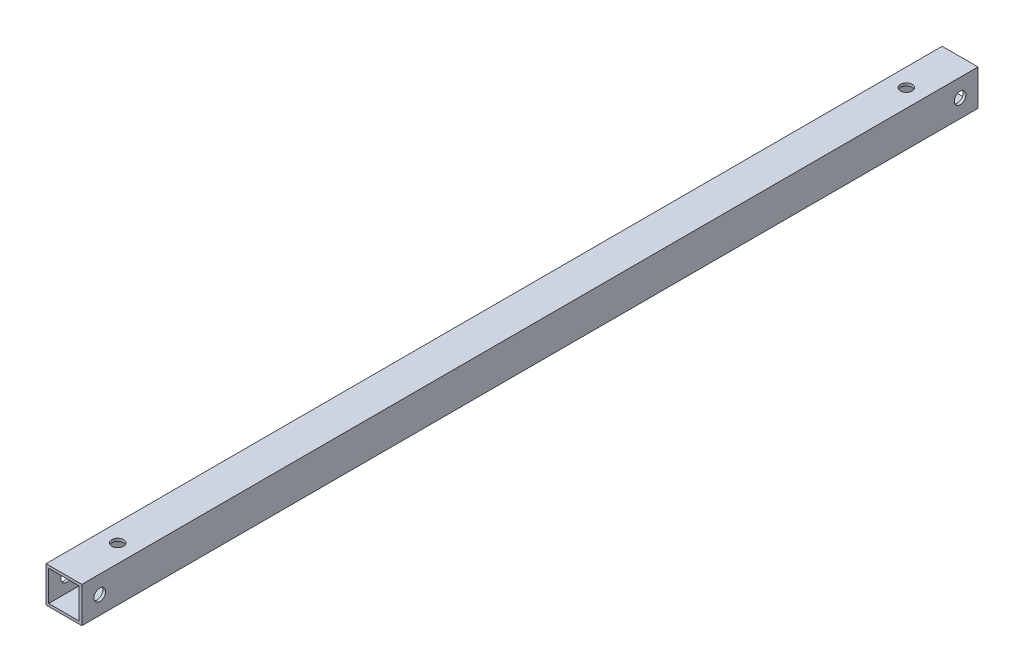
ISO-10303-21;
HEADER;
FILE_DESCRIPTION(('STEP AP214'),'2;1');
FILE_NAME('part.step','',(''),(''),'','','');
FILE_SCHEMA(('AUTOMOTIVE_DESIGN { 1 0 10303 214 1 1 1 1 }'));
ENDSEC;
DATA;
#1=APPLICATION_CONTEXT('core data for automotive mechanical design processes');
#2=APPLICATION_PROTOCOL_DEFINITION('international standard','automotive_design',2000,#1);
#3=PRODUCT_CONTEXT('',#1,'mechanical');
#4=PRODUCT('Part','Part','',(#3));
#5=PRODUCT_RELATED_PRODUCT_CATEGORY('part','',(#4));
#6=PRODUCT_DEFINITION_FORMATION('','',#4);
#7=PRODUCT_DEFINITION_CONTEXT('part definition',#1,'design');
#8=PRODUCT_DEFINITION('design','',#6,#7);
#9=PRODUCT_DEFINITION_SHAPE('','',#8);
#10=(LENGTH_UNIT() NAMED_UNIT(*) SI_UNIT(.MILLI.,.METRE.));
#11=(NAMED_UNIT(*) PLANE_ANGLE_UNIT() SI_UNIT($,.RADIAN.));
#12=(NAMED_UNIT(*) SI_UNIT($,.STERADIAN.) SOLID_ANGLE_UNIT());
#13=UNCERTAINTY_MEASURE_WITH_UNIT(LENGTH_MEASURE(1.E-05),#10,'distance_accuracy_value','');
#14=(GEOMETRIC_REPRESENTATION_CONTEXT(3) GLOBAL_UNCERTAINTY_ASSIGNED_CONTEXT((#13)) GLOBAL_UNIT_ASSIGNED_CONTEXT((#10,
#11,#12)) REPRESENTATION_CONTEXT('',''));
#15=CARTESIAN_POINT('',(0.,0.,0.));
#16=DIRECTION('',(0.,0.,1.));
#17=DIRECTION('',(1.,0.,0.));
#18=AXIS2_PLACEMENT_3D('',#15,#16,#17);
#19=CARTESIAN_POINT('',(-10.,-10.,-250.));
#20=DIRECTION('',(-1.,0.,0.));
#21=DIRECTION('',(0.,0.,1.));
#22=AXIS2_PLACEMENT_3D('',#19,#20,#21);
#23=PLANE('',#22);
#24=CARTESIAN_POINT('',(-10.,0.,-240.));
#25=DIRECTION('',(-1.,0.,0.));
#26=DIRECTION('',(0.,0.,1.));
#27=AXIS2_PLACEMENT_3D('',#24,#25,#26);
#28=CIRCLE('',#27,3.25000000000001);
#29=CARTESIAN_POINT('',(-10.,0.,-236.75));
#30=VERTEX_POINT('',#29);
#31=EDGE_CURVE('E179',#30,#30,#28,.T.);
#32=ORIENTED_EDGE('',*,*,#31,.F.);
#33=EDGE_LOOP('',(#32));
#34=FACE_BOUND('',#33,.T.);
#35=CARTESIAN_POINT('',(-10.,0.,240.));
#36=DIRECTION('',(-1.,0.,0.));
#37=DIRECTION('',(0.,0.,1.));
#38=AXIS2_PLACEMENT_3D('',#35,#36,#37);
#39=CIRCLE('',#38,3.25000000000001);
#40=CARTESIAN_POINT('',(-10.,0.,243.25));
#41=VERTEX_POINT('',#40);
#42=EDGE_CURVE('E175',#41,#41,#39,.T.);
#43=ORIENTED_EDGE('',*,*,#42,.F.);
#44=EDGE_LOOP('',(#43));
#45=FACE_BOUND('',#44,.T.);
#46=DIRECTION('',(0.,-1.,0.));
#47=VECTOR('',#46,1.);
#48=CARTESIAN_POINT('',(-10.,-10.,250.));
#49=LINE('',#48,#47);
#50=CARTESIAN_POINT('',(-10.,9.99999999999995,250.));
#51=VERTEX_POINT('',#50);
#52=CARTESIAN_POINT('',(-10.,-10.,250.));
#53=VERTEX_POINT('',#52);
#54=EDGE_CURVE('E135',#51,#53,#49,.T.);
#55=ORIENTED_EDGE('',*,*,#54,.F.);
#56=DIRECTION('',(0.,0.,1.));
#57=VECTOR('',#56,1.);
#58=CARTESIAN_POINT('',(-10.,9.99999999999995,-250.));
#59=LINE('',#58,#57);
#60=CARTESIAN_POINT('',(-10.,9.99999999999995,-250.));
#61=VERTEX_POINT('',#60);
#62=EDGE_CURVE('E11',#61,#51,#59,.T.);
#63=ORIENTED_EDGE('',*,*,#62,.F.);
#64=DIRECTION('',(0.,-1.,0.));
#65=VECTOR('',#64,1.);
#66=CARTESIAN_POINT('',(-10.,-10.,-250.));
#67=LINE('',#66,#65);
#68=CARTESIAN_POINT('',(-10.,-10.,-250.));
#69=VERTEX_POINT('',#68);
#70=EDGE_CURVE('E139',#61,#69,#67,.T.);
#71=ORIENTED_EDGE('',*,*,#70,.T.);
#72=DIRECTION('',(0.,0.,1.));
#73=VECTOR('',#72,1.);
#74=CARTESIAN_POINT('',(-10.,-10.,-250.));
#75=LINE('',#74,#73);
#76=EDGE_CURVE('E152',#69,#53,#75,.T.);
#77=ORIENTED_EDGE('',*,*,#76,.T.);
#78=EDGE_LOOP('',(#55,#63,#71,#77));
#79=FACE_BOUND('',#78,.T.);
#80=ADVANCED_FACE('F34',(#34,#45,#79),#23,.T.);
#81=CARTESIAN_POINT('',(9.99999999999997,9.99999999999995,-250.));
#82=DIRECTION('',(0.,1.,0.));
#83=DIRECTION('',(0.,0.,1.));
#84=AXIS2_PLACEMENT_3D('',#81,#82,#83);
#85=PLANE('',#84);
#86=CARTESIAN_POINT('',(0.,9.99999999999995,-220.));
#87=DIRECTION('',(0.,1.,0.));
#88=DIRECTION('',(0.,0.,1.));
#89=AXIS2_PLACEMENT_3D('',#86,#87,#88);
#90=CIRCLE('',#89,3.25);
#91=CARTESIAN_POINT('',(0.,9.99999999999995,-216.75));
#92=VERTEX_POINT('',#91);
#93=EDGE_CURVE('E171',#92,#92,#90,.T.);
#94=ORIENTED_EDGE('',*,*,#93,.F.);
#95=EDGE_LOOP('',(#94));
#96=FACE_BOUND('',#95,.T.);
#97=CARTESIAN_POINT('',(0.,9.99999999999995,220.));
#98=DIRECTION('',(0.,1.,0.));
#99=DIRECTION('',(0.,0.,1.));
#100=AXIS2_PLACEMENT_3D('',#97,#98,#99);
#101=CIRCLE('',#100,3.25);
#102=CARTESIAN_POINT('',(0.,9.99999999999995,223.25));
#103=VERTEX_POINT('',#102);
#104=EDGE_CURVE('E123',#103,#103,#101,.T.);
#105=ORIENTED_EDGE('',*,*,#104,.F.);
#106=EDGE_LOOP('',(#105));
#107=FACE_BOUND('',#106,.T.);
#108=DIRECTION('',(-1.,0.,0.));
#109=VECTOR('',#108,1.);
#110=CARTESIAN_POINT('',(9.99999999999997,9.99999999999995,250.));
#111=LINE('',#110,#109);
#112=CARTESIAN_POINT('',(9.99999999999997,9.99999999999995,250.));
#113=VERTEX_POINT('',#112);
#114=EDGE_CURVE('E143',#113,#51,#111,.T.);
#115=ORIENTED_EDGE('',*,*,#114,.F.);
#116=DIRECTION('',(0.,0.,1.));
#117=VECTOR('',#116,1.);
#118=CARTESIAN_POINT('',(9.99999999999997,9.99999999999995,-250.));
#119=LINE('',#118,#117);
#120=CARTESIAN_POINT('',(9.99999999999997,9.99999999999995,-250.));
#121=VERTEX_POINT('',#120);
#122=EDGE_CURVE('E42',#121,#113,#119,.T.);
#123=ORIENTED_EDGE('',*,*,#122,.F.);
#124=DIRECTION('',(-1.,0.,0.));
#125=VECTOR('',#124,1.);
#126=CARTESIAN_POINT('',(9.99999999999997,9.99999999999995,-250.));
#127=LINE('',#126,#125);
#128=EDGE_CURVE('E149',#121,#61,#127,.T.);
#129=ORIENTED_EDGE('',*,*,#128,.T.);
#130=ORIENTED_EDGE('',*,*,#62,.T.);
#131=EDGE_LOOP('',(#115,#123,#129,#130));
#132=FACE_BOUND('',#131,.T.);
#133=ADVANCED_FACE('F217',(#96,#107,#132),#85,.T.);
#134=CARTESIAN_POINT('',(9.99999999999998,-10.,-250.));
#135=DIRECTION('',(1.,0.,0.));
#136=DIRECTION('',(0.,1.,0.));
#137=AXIS2_PLACEMENT_3D('',#134,#135,#136);
#138=PLANE('',#137);
#139=CARTESIAN_POINT('',(9.99999999999998,0.,-240.));
#140=DIRECTION('',(1.,0.,0.));
#141=DIRECTION('',(0.,1.,0.));
#142=AXIS2_PLACEMENT_3D('',#139,#140,#141);
#143=CIRCLE('',#142,3.25000000000001);
#144=CARTESIAN_POINT('',(9.99999999999998,3.25000000000001,-240.));
#145=VERTEX_POINT('',#144);
#146=EDGE_CURVE('E186',#145,#145,#143,.T.);
#147=ORIENTED_EDGE('',*,*,#146,.F.);
#148=EDGE_LOOP('',(#147));
#149=FACE_BOUND('',#148,.T.);
#150=CARTESIAN_POINT('',(9.99999999999998,0.,240.));
#151=DIRECTION('',(1.,0.,0.));
#152=DIRECTION('',(0.,1.,0.));
#153=AXIS2_PLACEMENT_3D('',#150,#151,#152);
#154=CIRCLE('',#153,3.25000000000001);
#155=CARTESIAN_POINT('',(9.99999999999998,3.25000000000001,240.));
#156=VERTEX_POINT('',#155);
#157=EDGE_CURVE('E183',#156,#156,#154,.T.);
#158=ORIENTED_EDGE('',*,*,#157,.F.);
#159=EDGE_LOOP('',(#158));
#160=FACE_BOUND('',#159,.T.);
#161=DIRECTION('',(0.,1.,0.));
#162=VECTOR('',#161,1.);
#163=CARTESIAN_POINT('',(9.99999999999998,-10.,250.));
#164=LINE('',#163,#162);
#165=CARTESIAN_POINT('',(9.99999999999998,-10.,250.));
#166=VERTEX_POINT('',#165);
#167=EDGE_CURVE('E158',#166,#113,#164,.T.);
#168=ORIENTED_EDGE('',*,*,#167,.F.);
#169=DIRECTION('',(0.,0.,1.));
#170=VECTOR('',#169,1.);
#171=CARTESIAN_POINT('',(9.99999999999998,-10.,-250.));
#172=LINE('',#171,#170);
#173=CARTESIAN_POINT('',(9.99999999999998,-10.,-250.));
#174=VERTEX_POINT('',#173);
#175=EDGE_CURVE('E164',#174,#166,#172,.T.);
#176=ORIENTED_EDGE('',*,*,#175,.F.);
#177=DIRECTION('',(0.,1.,0.));
#178=VECTOR('',#177,1.);
#179=CARTESIAN_POINT('',(9.99999999999998,-10.,-250.));
#180=LINE('',#179,#178);
#181=EDGE_CURVE('E146',#174,#121,#180,.T.);
#182=ORIENTED_EDGE('',*,*,#181,.T.);
#183=ORIENTED_EDGE('',*,*,#122,.T.);
#184=EDGE_LOOP('',(#168,#176,#182,#183));
#185=FACE_BOUND('',#184,.T.);
#186=ADVANCED_FACE('F220',(#149,#160,#185),#138,.T.);
#187=CARTESIAN_POINT('',(9.99999999999998,-10.,-250.));
#188=DIRECTION('',(0.,-1.,0.));
#189=DIRECTION('',(1.,0.,0.));
#190=AXIS2_PLACEMENT_3D('',#187,#188,#189);
#191=PLANE('',#190);
#192=CARTESIAN_POINT('',(0.,-10.,-220.));
#193=DIRECTION('',(0.,-1.,0.));
#194=DIRECTION('',(1.,0.,0.));
#195=AXIS2_PLACEMENT_3D('',#192,#193,#194);
#196=CIRCLE('',#195,3.25);
#197=CARTESIAN_POINT('',(3.25,-10.,-220.));
#198=VERTEX_POINT('',#197);
#199=EDGE_CURVE('E201',#198,#198,#196,.T.);
#200=ORIENTED_EDGE('',*,*,#199,.F.);
#201=EDGE_LOOP('',(#200));
#202=FACE_BOUND('',#201,.T.);
#203=CARTESIAN_POINT('',(0.,-10.,220.));
#204=DIRECTION('',(0.,-1.,0.));
#205=DIRECTION('',(1.,0.,0.));
#206=AXIS2_PLACEMENT_3D('',#203,#204,#205);
#207=CIRCLE('',#206,3.25);
#208=CARTESIAN_POINT('',(3.25,-10.,220.));
#209=VERTEX_POINT('',#208);
#210=EDGE_CURVE('E207',#209,#209,#207,.T.);
#211=ORIENTED_EDGE('',*,*,#210,.F.);
#212=EDGE_LOOP('',(#211));
#213=FACE_BOUND('',#212,.T.);
#214=DIRECTION('',(1.,0.,0.));
#215=VECTOR('',#214,1.);
#216=CARTESIAN_POINT('',(9.99999999999998,-10.,250.));
#217=LINE('',#216,#215);
#218=EDGE_CURVE('E155',#53,#166,#217,.T.);
#219=ORIENTED_EDGE('',*,*,#218,.F.);
#220=ORIENTED_EDGE('',*,*,#76,.F.);
#221=DIRECTION('',(1.,0.,0.));
#222=VECTOR('',#221,1.);
#223=CARTESIAN_POINT('',(9.99999999999998,-10.,-250.));
#224=LINE('',#223,#222);
#225=EDGE_CURVE('E142',#69,#174,#224,.T.);
#226=ORIENTED_EDGE('',*,*,#225,.T.);
#227=ORIENTED_EDGE('',*,*,#175,.T.);
#228=EDGE_LOOP('',(#219,#220,#226,#227));
#229=FACE_BOUND('',#228,.T.);
#230=ADVANCED_FACE('F236',(#202,#213,#229),#191,.T.);
#231=CARTESIAN_POINT('',(-10.,9.99999999999995,-250.));
#232=DIRECTION('',(0.,0.,1.));
#233=DIRECTION('',(1.,0.,0.));
#234=AXIS2_PLACEMENT_3D('',#231,#232,#233);
#235=PLANE('',#234);
#236=DIRECTION('',(-1.,0.,0.));
#237=VECTOR('',#236,1.);
#238=CARTESIAN_POINT('',(8.5,8.5,-250.));
#239=LINE('',#238,#237);
#240=CARTESIAN_POINT('',(8.5,8.5,-250.));
#241=VERTEX_POINT('',#240);
#242=CARTESIAN_POINT('',(-8.5,8.5,-250.));
#243=VERTEX_POINT('',#242);
#244=EDGE_CURVE('E107',#241,#243,#239,.T.);
#245=ORIENTED_EDGE('',*,*,#244,.T.);
#246=DIRECTION('',(0.,-1.,0.));
#247=VECTOR('',#246,1.);
#248=CARTESIAN_POINT('',(-8.5,-8.5,-250.));
#249=LINE('',#248,#247);
#250=CARTESIAN_POINT('',(-8.5,-8.5,-250.));
#251=VERTEX_POINT('',#250);
#252=EDGE_CURVE('E101',#243,#251,#249,.T.);
#253=ORIENTED_EDGE('',*,*,#252,.T.);
#254=DIRECTION('',(1.,0.,0.));
#255=VECTOR('',#254,1.);
#256=CARTESIAN_POINT('',(8.5,-8.5,-250.));
#257=LINE('',#256,#255);
#258=CARTESIAN_POINT('',(8.5,-8.5,-250.));
#259=VERTEX_POINT('',#258);
#260=EDGE_CURVE('E110',#251,#259,#257,.T.);
#261=ORIENTED_EDGE('',*,*,#260,.T.);
#262=DIRECTION('',(0.,1.,0.));
#263=VECTOR('',#262,1.);
#264=CARTESIAN_POINT('',(8.5,-8.5,-250.));
#265=LINE('',#264,#263);
#266=EDGE_CURVE('E50',#259,#241,#265,.T.);
#267=ORIENTED_EDGE('',*,*,#266,.T.);
#268=EDGE_LOOP('',(#245,#253,#261,#267));
#269=FACE_BOUND('',#268,.T.);
#270=ORIENTED_EDGE('',*,*,#70,.F.);
#271=ORIENTED_EDGE('',*,*,#128,.F.);
#272=ORIENTED_EDGE('',*,*,#181,.F.);
#273=ORIENTED_EDGE('',*,*,#225,.F.);
#274=EDGE_LOOP('',(#270,#271,#272,#273));
#275=FACE_BOUND('',#274,.T.);
#276=ADVANCED_FACE('F114',(#269,#275),#235,.F.);
#277=CARTESIAN_POINT('',(-10.,9.99999999999995,250.));
#278=DIRECTION('',(0.,0.,1.));
#279=DIRECTION('',(1.,0.,0.));
#280=AXIS2_PLACEMENT_3D('',#277,#278,#279);
#281=PLANE('',#280);
#282=DIRECTION('',(0.,-1.,0.));
#283=VECTOR('',#282,1.);
#284=CARTESIAN_POINT('',(-8.5,-8.5,250.));
#285=LINE('',#284,#283);
#286=CARTESIAN_POINT('',(-8.5,8.5,250.));
#287=VERTEX_POINT('',#286);
#288=CARTESIAN_POINT('',(-8.5,-8.5,250.));
#289=VERTEX_POINT('',#288);
#290=EDGE_CURVE('E58',#287,#289,#285,.T.);
#291=ORIENTED_EDGE('',*,*,#290,.F.);
#292=DIRECTION('',(-1.,0.,0.));
#293=VECTOR('',#292,1.);
#294=CARTESIAN_POINT('',(8.5,8.5,250.));
#295=LINE('',#294,#293);
#296=CARTESIAN_POINT('',(8.5,8.5,250.));
#297=VERTEX_POINT('',#296);
#298=EDGE_CURVE('E117',#297,#287,#295,.T.);
#299=ORIENTED_EDGE('',*,*,#298,.F.);
#300=DIRECTION('',(0.,1.,0.));
#301=VECTOR('',#300,1.);
#302=CARTESIAN_POINT('',(8.5,-8.5,250.));
#303=LINE('',#302,#301);
#304=CARTESIAN_POINT('',(8.5,-8.5,250.));
#305=VERTEX_POINT('',#304);
#306=EDGE_CURVE('E120',#305,#297,#303,.T.);
#307=ORIENTED_EDGE('',*,*,#306,.F.);
#308=DIRECTION('',(1.,0.,0.));
#309=VECTOR('',#308,1.);
#310=CARTESIAN_POINT('',(8.5,-8.5,250.));
#311=LINE('',#310,#309);
#312=EDGE_CURVE('E129',#289,#305,#311,.T.);
#313=ORIENTED_EDGE('',*,*,#312,.F.);
#314=EDGE_LOOP('',(#291,#299,#307,#313));
#315=FACE_BOUND('',#314,.T.);
#316=ORIENTED_EDGE('',*,*,#54,.T.);
#317=ORIENTED_EDGE('',*,*,#218,.T.);
#318=ORIENTED_EDGE('',*,*,#167,.T.);
#319=ORIENTED_EDGE('',*,*,#114,.T.);
#320=EDGE_LOOP('',(#316,#317,#318,#319));
#321=FACE_BOUND('',#320,.T.);
#322=ADVANCED_FACE('F226',(#315,#321),#281,.T.);
#323=CARTESIAN_POINT('',(-8.5,-8.5,-250.));
#324=DIRECTION('',(-1.,0.,0.));
#325=DIRECTION('',(0.,0.,1.));
#326=AXIS2_PLACEMENT_3D('',#323,#324,#325);
#327=PLANE('',#326);
#328=CARTESIAN_POINT('',(-8.5,0.,-240.));
#329=DIRECTION('',(-1.,0.,0.));
#330=DIRECTION('',(0.,0.,1.));
#331=AXIS2_PLACEMENT_3D('',#328,#329,#330);
#332=CIRCLE('',#331,3.25000000000001);
#333=CARTESIAN_POINT('',(-8.5,0.,-236.75));
#334=VERTEX_POINT('',#333);
#335=EDGE_CURVE('E191',#334,#334,#332,.T.);
#336=ORIENTED_EDGE('',*,*,#335,.T.);
#337=EDGE_LOOP('',(#336));
#338=FACE_BOUND('',#337,.T.);
#339=CARTESIAN_POINT('',(-8.5,0.,240.));
#340=DIRECTION('',(-1.,0.,0.));
#341=DIRECTION('',(0.,0.,1.));
#342=AXIS2_PLACEMENT_3D('',#339,#340,#341);
#343=CIRCLE('',#342,3.25000000000001);
#344=CARTESIAN_POINT('',(-8.5,0.,243.25));
#345=VERTEX_POINT('',#344);
#346=EDGE_CURVE('E178',#345,#345,#343,.T.);
#347=ORIENTED_EDGE('',*,*,#346,.T.);
#348=EDGE_LOOP('',(#347));
#349=FACE_BOUND('',#348,.T.);
#350=ORIENTED_EDGE('',*,*,#290,.T.);
#351=DIRECTION('',(0.,0.,1.));
#352=VECTOR('',#351,1.);
#353=CARTESIAN_POINT('',(-8.5,-8.5,-250.));
#354=LINE('',#353,#352);
#355=EDGE_CURVE('E97',#251,#289,#354,.T.);
#356=ORIENTED_EDGE('',*,*,#355,.F.);
#357=ORIENTED_EDGE('',*,*,#252,.F.);
#358=DIRECTION('',(0.,0.,1.));
#359=VECTOR('',#358,1.);
#360=CARTESIAN_POINT('',(-8.5,8.5,-250.));
#361=LINE('',#360,#359);
#362=EDGE_CURVE('E133',#243,#287,#361,.T.);
#363=ORIENTED_EDGE('',*,*,#362,.T.);
#364=EDGE_LOOP('',(#350,#356,#357,#363));
#365=FACE_BOUND('',#364,.T.);
#366=ADVANCED_FACE('F99',(#338,#349,#365),#327,.F.);
#367=CARTESIAN_POINT('',(8.5,8.5,-250.));
#368=DIRECTION('',(0.,1.,0.));
#369=DIRECTION('',(0.,0.,1.));
#370=AXIS2_PLACEMENT_3D('',#367,#368,#369);
#371=PLANE('',#370);
#372=CARTESIAN_POINT('',(0.,8.5,-220.));
#373=DIRECTION('',(0.,1.,0.));
#374=DIRECTION('',(0.,0.,1.));
#375=AXIS2_PLACEMENT_3D('',#372,#373,#374);
#376=CIRCLE('',#375,3.25);
#377=CARTESIAN_POINT('',(0.,8.5,-216.75));
#378=VERTEX_POINT('',#377);
#379=EDGE_CURVE('E174',#378,#378,#376,.T.);
#380=ORIENTED_EDGE('',*,*,#379,.T.);
#381=EDGE_LOOP('',(#380));
#382=FACE_BOUND('',#381,.T.);
#383=CARTESIAN_POINT('',(0.,8.5,220.));
#384=DIRECTION('',(0.,1.,0.));
#385=DIRECTION('',(0.,0.,1.));
#386=AXIS2_PLACEMENT_3D('',#383,#384,#385);
#387=CIRCLE('',#386,3.25);
#388=CARTESIAN_POINT('',(0.,8.5,223.25));
#389=VERTEX_POINT('',#388);
#390=EDGE_CURVE('E170',#389,#389,#387,.T.);
#391=ORIENTED_EDGE('',*,*,#390,.T.);
#392=EDGE_LOOP('',(#391));
#393=FACE_BOUND('',#392,.T.);
#394=ORIENTED_EDGE('',*,*,#298,.T.);
#395=ORIENTED_EDGE('',*,*,#362,.F.);
#396=ORIENTED_EDGE('',*,*,#244,.F.);
#397=DIRECTION('',(0.,0.,1.));
#398=VECTOR('',#397,1.);
#399=CARTESIAN_POINT('',(8.5,8.5,-250.));
#400=LINE('',#399,#398);
#401=EDGE_CURVE('E136',#241,#297,#400,.T.);
#402=ORIENTED_EDGE('',*,*,#401,.T.);
#403=EDGE_LOOP('',(#394,#395,#396,#402));
#404=FACE_BOUND('',#403,.T.);
#405=ADVANCED_FACE('F266',(#382,#393,#404),#371,.F.);
#406=CARTESIAN_POINT('',(8.5,-8.5,-250.));
#407=DIRECTION('',(1.,0.,0.));
#408=DIRECTION('',(0.,0.,-1.));
#409=AXIS2_PLACEMENT_3D('',#406,#407,#408);
#410=PLANE('',#409);
#411=CARTESIAN_POINT('',(8.5,0.,-240.));
#412=DIRECTION('',(1.,0.,0.));
#413=DIRECTION('',(0.,0.,-1.));
#414=AXIS2_PLACEMENT_3D('',#411,#412,#413);
#415=CIRCLE('',#414,3.25000000000001);
#416=CARTESIAN_POINT('',(8.5,0.,-243.25));
#417=VERTEX_POINT('',#416);
#418=EDGE_CURVE('E37',#417,#417,#415,.T.);
#419=ORIENTED_EDGE('',*,*,#418,.T.);
#420=EDGE_LOOP('',(#419));
#421=FACE_BOUND('',#420,.T.);
#422=CARTESIAN_POINT('',(8.5,0.,240.));
#423=DIRECTION('',(1.,0.,0.));
#424=DIRECTION('',(0.,0.,-1.));
#425=AXIS2_PLACEMENT_3D('',#422,#423,#424);
#426=CIRCLE('',#425,3.25000000000001);
#427=CARTESIAN_POINT('',(8.5,0.,236.75));
#428=VERTEX_POINT('',#427);
#429=EDGE_CURVE('E176',#428,#428,#426,.T.);
#430=ORIENTED_EDGE('',*,*,#429,.T.);
#431=EDGE_LOOP('',(#430));
#432=FACE_BOUND('',#431,.T.);
#433=ORIENTED_EDGE('',*,*,#306,.T.);
#434=ORIENTED_EDGE('',*,*,#401,.F.);
#435=ORIENTED_EDGE('',*,*,#266,.F.);
#436=DIRECTION('',(0.,0.,1.));
#437=VECTOR('',#436,1.);
#438=CARTESIAN_POINT('',(8.5,-8.5,-250.));
#439=LINE('',#438,#437);
#440=EDGE_CURVE('E106',#259,#305,#439,.T.);
#441=ORIENTED_EDGE('',*,*,#440,.T.);
#442=EDGE_LOOP('',(#433,#434,#435,#441));
#443=FACE_BOUND('',#442,.T.);
#444=ADVANCED_FACE('F272',(#421,#432,#443),#410,.F.);
#445=CARTESIAN_POINT('',(8.5,-8.5,-250.));
#446=DIRECTION('',(0.,-1.,0.));
#447=DIRECTION('',(0.,0.,-1.));
#448=AXIS2_PLACEMENT_3D('',#445,#446,#447);
#449=PLANE('',#448);
#450=CARTESIAN_POINT('',(0.,-8.5,-220.));
#451=DIRECTION('',(0.,-1.,0.));
#452=DIRECTION('',(0.,0.,-1.));
#453=AXIS2_PLACEMENT_3D('',#450,#451,#452);
#454=CIRCLE('',#453,3.25);
#455=CARTESIAN_POINT('',(0.,-8.5,-223.25));
#456=VERTEX_POINT('',#455);
#457=EDGE_CURVE('E172',#456,#456,#454,.T.);
#458=ORIENTED_EDGE('',*,*,#457,.T.);
#459=EDGE_LOOP('',(#458));
#460=FACE_BOUND('',#459,.T.);
#461=CARTESIAN_POINT('',(0.,-8.5,220.));
#462=DIRECTION('',(0.,-1.,0.));
#463=DIRECTION('',(0.,0.,-1.));
#464=AXIS2_PLACEMENT_3D('',#461,#462,#463);
#465=CIRCLE('',#464,3.25);
#466=CARTESIAN_POINT('',(0.,-8.5,216.75));
#467=VERTEX_POINT('',#466);
#468=EDGE_CURVE('E167',#467,#467,#465,.T.);
#469=ORIENTED_EDGE('',*,*,#468,.T.);
#470=EDGE_LOOP('',(#469));
#471=FACE_BOUND('',#470,.T.);
#472=ORIENTED_EDGE('',*,*,#312,.T.);
#473=ORIENTED_EDGE('',*,*,#440,.F.);
#474=ORIENTED_EDGE('',*,*,#260,.F.);
#475=ORIENTED_EDGE('',*,*,#355,.T.);
#476=EDGE_LOOP('',(#472,#473,#474,#475));
#477=FACE_BOUND('',#476,.T.);
#478=ADVANCED_FACE('F111',(#460,#471,#477),#449,.F.);
#479=CARTESIAN_POINT('',(0.,-15.,220.));
#480=DIRECTION('',(0.,1.,0.));
#481=DIRECTION('',(0.,0.,1.));
#482=AXIS2_PLACEMENT_3D('',#479,#480,#481);
#483=CYLINDRICAL_SURFACE('',#482,3.25);
#484=ORIENTED_EDGE('',*,*,#210,.T.);
#485=EDGE_LOOP('',(#484));
#486=FACE_BOUND('',#485,.T.);
#487=ORIENTED_EDGE('',*,*,#468,.F.);
#488=EDGE_LOOP('',(#487));
#489=FACE_BOUND('',#488,.T.);
#490=ADVANCED_FACE('F282',(#486,#489),#483,.F.);
#491=ORIENTED_EDGE('',*,*,#104,.T.);
#492=EDGE_LOOP('',(#491));
#493=FACE_BOUND('',#492,.T.);
#494=ORIENTED_EDGE('',*,*,#390,.F.);
#495=EDGE_LOOP('',(#494));
#496=FACE_BOUND('',#495,.T.);
#497=ADVANCED_FACE('F214',(#493,#496),#483,.F.);
#498=CARTESIAN_POINT('',(0.,-15.,-220.));
#499=DIRECTION('',(0.,1.,0.));
#500=DIRECTION('',(0.,0.,1.));
#501=AXIS2_PLACEMENT_3D('',#498,#499,#500);
#502=CYLINDRICAL_SURFACE('',#501,3.25);
#503=ORIENTED_EDGE('',*,*,#199,.T.);
#504=EDGE_LOOP('',(#503));
#505=FACE_BOUND('',#504,.T.);
#506=ORIENTED_EDGE('',*,*,#457,.F.);
#507=EDGE_LOOP('',(#506));
#508=FACE_BOUND('',#507,.T.);
#509=ADVANCED_FACE('F288',(#505,#508),#502,.F.);
#510=ORIENTED_EDGE('',*,*,#93,.T.);
#511=EDGE_LOOP('',(#510));
#512=FACE_BOUND('',#511,.T.);
#513=ORIENTED_EDGE('',*,*,#379,.F.);
#514=EDGE_LOOP('',(#513));
#515=FACE_BOUND('',#514,.T.);
#516=ADVANCED_FACE('F289',(#512,#515),#502,.F.);
#517=CARTESIAN_POINT('',(-15.,0.,240.));
#518=DIRECTION('',(1.,0.,0.));
#519=DIRECTION('',(0.,0.,-1.));
#520=AXIS2_PLACEMENT_3D('',#517,#518,#519);
#521=CYLINDRICAL_SURFACE('',#520,3.25000000000001);
#522=ORIENTED_EDGE('',*,*,#157,.T.);
#523=EDGE_LOOP('',(#522));
#524=FACE_BOUND('',#523,.T.);
#525=ORIENTED_EDGE('',*,*,#429,.F.);
#526=EDGE_LOOP('',(#525));
#527=FACE_BOUND('',#526,.T.);
#528=ADVANCED_FACE('F261',(#524,#527),#521,.F.);
#529=ORIENTED_EDGE('',*,*,#42,.T.);
#530=EDGE_LOOP('',(#529));
#531=FACE_BOUND('',#530,.T.);
#532=ORIENTED_EDGE('',*,*,#346,.F.);
#533=EDGE_LOOP('',(#532));
#534=FACE_BOUND('',#533,.T.);
#535=ADVANCED_FACE('F257',(#531,#534),#521,.F.);
#536=CARTESIAN_POINT('',(-15.,0.,-240.));
#537=DIRECTION('',(1.,0.,0.));
#538=DIRECTION('',(0.,0.,-1.));
#539=AXIS2_PLACEMENT_3D('',#536,#537,#538);
#540=CYLINDRICAL_SURFACE('',#539,3.25000000000001);
#541=ORIENTED_EDGE('',*,*,#146,.T.);
#542=EDGE_LOOP('',(#541));
#543=FACE_BOUND('',#542,.T.);
#544=ORIENTED_EDGE('',*,*,#418,.F.);
#545=EDGE_LOOP('',(#544));
#546=FACE_BOUND('',#545,.T.);
#547=ADVANCED_FACE('F260',(#543,#546),#540,.F.);
#548=ORIENTED_EDGE('',*,*,#31,.T.);
#549=EDGE_LOOP('',(#548));
#550=FACE_BOUND('',#549,.T.);
#551=ORIENTED_EDGE('',*,*,#335,.F.);
#552=EDGE_LOOP('',(#551));
#553=FACE_BOUND('',#552,.T.);
#554=ADVANCED_FACE('F293',(#550,#553),#540,.F.);
#555=CLOSED_SHELL('',(#80,#133,#186,#230,#276,#322,#366,#405,#444,#478,#490,#497,#509,#516,#528,
#535,#547,#554));
#556=MANIFOLD_SOLID_BREP('B2',#555);
#557=ADVANCED_BREP_SHAPE_REPRESENTATION('',(#18,#556),#14);
#558=SHAPE_DEFINITION_REPRESENTATION(#9,#557);
ENDSEC;
END-ISO-10303-21;
